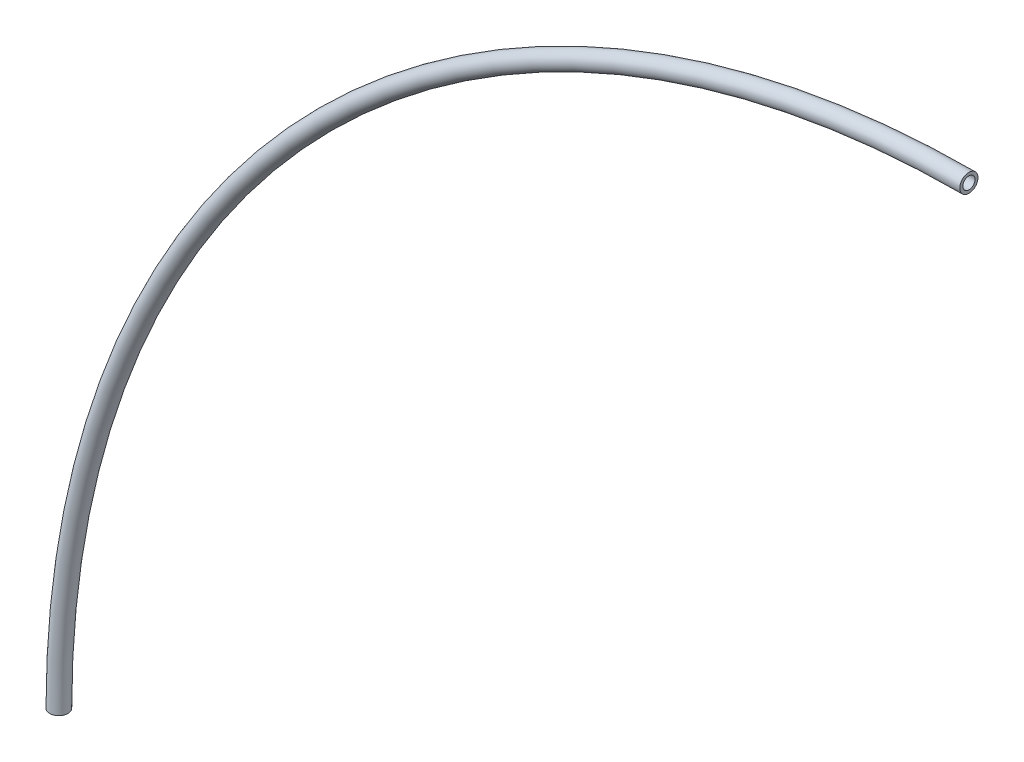
ISO-10303-21;
HEADER;
FILE_DESCRIPTION(('STEP AP214'),'2;1');
FILE_NAME('part.step','',(''),(''),'','','');
FILE_SCHEMA(('AUTOMOTIVE_DESIGN { 1 0 10303 214 1 1 1 1 }'));
ENDSEC;
DATA;
#1=APPLICATION_CONTEXT('core data for automotive mechanical design processes');
#2=APPLICATION_PROTOCOL_DEFINITION('international standard','automotive_design',2000,#1);
#3=PRODUCT_CONTEXT('',#1,'mechanical');
#4=PRODUCT('Part','Part','',(#3));
#5=PRODUCT_RELATED_PRODUCT_CATEGORY('part','',(#4));
#6=PRODUCT_DEFINITION_FORMATION('','',#4);
#7=PRODUCT_DEFINITION_CONTEXT('part definition',#1,'design');
#8=PRODUCT_DEFINITION('design','',#6,#7);
#9=PRODUCT_DEFINITION_SHAPE('','',#8);
#10=(LENGTH_UNIT() NAMED_UNIT(*) SI_UNIT(.MILLI.,.METRE.));
#11=(NAMED_UNIT(*) PLANE_ANGLE_UNIT() SI_UNIT($,.RADIAN.));
#12=(NAMED_UNIT(*) SI_UNIT($,.STERADIAN.) SOLID_ANGLE_UNIT());
#13=UNCERTAINTY_MEASURE_WITH_UNIT(LENGTH_MEASURE(1.E-05),#10,'distance_accuracy_value','');
#14=(GEOMETRIC_REPRESENTATION_CONTEXT(3) GLOBAL_UNCERTAINTY_ASSIGNED_CONTEXT((#13)) GLOBAL_UNIT_ASSIGNED_CONTEXT((#10,
#11,#12)) REPRESENTATION_CONTEXT('',''));
#15=CARTESIAN_POINT('',(0.,0.,0.));
#16=DIRECTION('',(0.,0.,1.));
#17=DIRECTION('',(1.,0.,0.));
#18=AXIS2_PLACEMENT_3D('',#15,#16,#17);
#19=CARTESIAN_POINT('',(-600.,0.,0.));
#20=DIRECTION('',(0.,1.,0.));
#21=DIRECTION('',(-1.,0.,0.));
#22=AXIS2_PLACEMENT_3D('',#19,#20,#21);
#23=PLANE('',#22);
#24=CARTESIAN_POINT('',(-600.,0.,0.));
#25=DIRECTION('',(0.,1.,0.));
#26=DIRECTION('',(-1.,0.,0.));
#27=AXIS2_PLACEMENT_3D('',#24,#25,#26);
#28=CIRCLE('',#27,4.00000000000001);
#29=CARTESIAN_POINT('',(-604.,0.,0.));
#30=VERTEX_POINT('',#29);
#31=EDGE_CURVE('E60',#30,#30,#28,.T.);
#32=ORIENTED_EDGE('',*,*,#31,.T.);
#33=EDGE_LOOP('',(#32));
#34=FACE_BOUND('',#33,.T.);
#35=CARTESIAN_POINT('',(-600.,0.,0.));
#36=DIRECTION('',(0.,1.,0.));
#37=DIRECTION('',(-1.,0.,0.));
#38=AXIS2_PLACEMENT_3D('',#35,#36,#37);
#39=CIRCLE('',#38,6.00000000000001);
#40=CARTESIAN_POINT('',(-606.,0.,0.));
#41=VERTEX_POINT('',#40);
#42=EDGE_CURVE('E50',#41,#41,#39,.T.);
#43=ORIENTED_EDGE('',*,*,#42,.F.);
#44=EDGE_LOOP('',(#43));
#45=FACE_BOUND('',#44,.T.);
#46=ADVANCED_FACE('F43',(#34,#45),#23,.F.);
#47=CARTESIAN_POINT('',(0.,600.,0.));
#48=DIRECTION('',(1.,0.,0.));
#49=DIRECTION('',(0.,1.,0.));
#50=AXIS2_PLACEMENT_3D('',#47,#48,#49);
#51=PLANE('',#50);
#52=CARTESIAN_POINT('',(0.,600.,0.));
#53=DIRECTION('',(1.,0.,0.));
#54=DIRECTION('',(0.,1.,0.));
#55=AXIS2_PLACEMENT_3D('',#52,#53,#54);
#56=CIRCLE('',#55,4.00000000000001);
#57=CARTESIAN_POINT('',(0.,604.,0.));
#58=VERTEX_POINT('',#57);
#59=EDGE_CURVE('E55',#58,#58,#56,.T.);
#60=ORIENTED_EDGE('',*,*,#59,.F.);
#61=EDGE_LOOP('',(#60));
#62=FACE_BOUND('',#61,.T.);
#63=CARTESIAN_POINT('',(0.,600.,0.));
#64=DIRECTION('',(1.,0.,0.));
#65=DIRECTION('',(0.,1.,0.));
#66=AXIS2_PLACEMENT_3D('',#63,#64,#65);
#67=CIRCLE('',#66,6.00000000000001);
#68=CARTESIAN_POINT('',(0.,606.,0.));
#69=VERTEX_POINT('',#68);
#70=EDGE_CURVE('E11',#69,#69,#67,.T.);
#71=ORIENTED_EDGE('',*,*,#70,.T.);
#72=EDGE_LOOP('',(#71));
#73=FACE_BOUND('',#72,.T.);
#74=ADVANCED_FACE('F77',(#62,#73),#51,.T.);
#75=CARTESIAN_POINT('',(0.,0.,0.));
#76=DIRECTION('',(0.,0.,-1.));
#77=DIRECTION('',(-1.,0.,0.));
#78=AXIS2_PLACEMENT_3D('',#75,#76,#77);
#79=TOROIDAL_SURFACE('',#78,600.,6.00000000000001);
#80=CARTESIAN_POINT('',(0.,0.,0.));
#81=DIRECTION('',(0.,0.,-1.));
#82=DIRECTION('',(-1.,0.,0.));
#83=AXIS2_PLACEMENT_3D('',#80,#81,#82);
#84=CIRCLE('',#83,606.);
#85=EDGE_CURVE('',#41,#69,#84,.T.);
#86=ORIENTED_EDGE('',*,*,#42,.T.);
#87=ORIENTED_EDGE('',*,*,#70,.F.);
#88=ORIENTED_EDGE('',*,*,#85,.T.);
#89=ORIENTED_EDGE('',*,*,#85,.F.);
#90=EDGE_LOOP('',(#86,#88,#87,#89));
#91=FACE_BOUND('',#90,.T.);
#92=ADVANCED_FACE('F71',(#91),#79,.T.);
#93=CARTESIAN_POINT('',(0.,0.,0.));
#94=DIRECTION('',(0.,0.,-1.));
#95=DIRECTION('',(-1.,0.,0.));
#96=AXIS2_PLACEMENT_3D('',#93,#94,#95);
#97=TOROIDAL_SURFACE('',#96,600.,4.00000000000001);
#98=CARTESIAN_POINT('',(0.,0.,0.));
#99=DIRECTION('',(0.,0.,-1.));
#100=DIRECTION('',(-1.,0.,0.));
#101=AXIS2_PLACEMENT_3D('',#98,#99,#100);
#102=CIRCLE('',#101,604.);
#103=EDGE_CURVE('',#30,#58,#102,.T.);
#104=ORIENTED_EDGE('',*,*,#31,.F.);
#105=ORIENTED_EDGE('',*,*,#59,.T.);
#106=ORIENTED_EDGE('',*,*,#103,.T.);
#107=ORIENTED_EDGE('',*,*,#103,.F.);
#108=EDGE_LOOP('',(#104,#106,#105,#107));
#109=FACE_BOUND('',#108,.T.);
#110=ADVANCED_FACE('F69',(#109),#97,.F.);
#111=CLOSED_SHELL('',(#46,#74,#92,#110));
#112=MANIFOLD_SOLID_BREP('B2',#111);
#113=ADVANCED_BREP_SHAPE_REPRESENTATION('',(#18,#112),#14);
#114=SHAPE_DEFINITION_REPRESENTATION(#9,#113);
ENDSEC;
END-ISO-10303-21;
